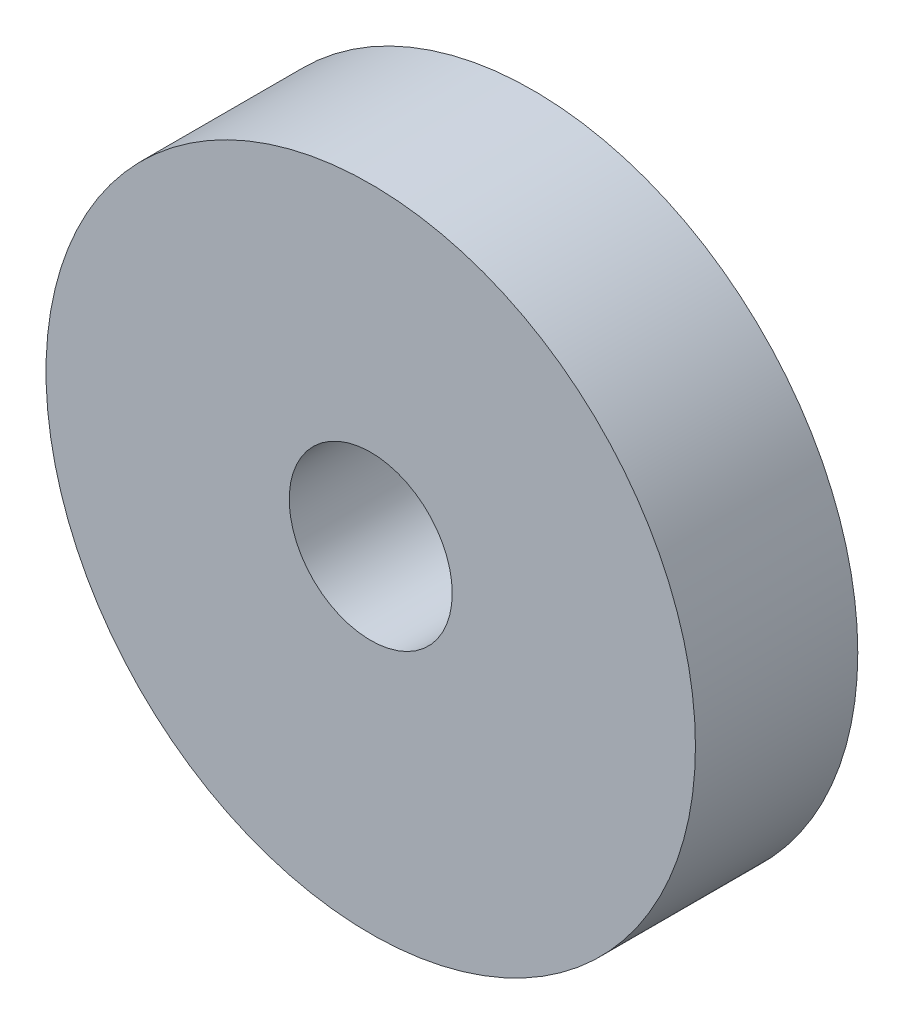
ISO-10303-21;
HEADER;
FILE_DESCRIPTION(('STEP AP214'),'2;1');
FILE_NAME('part.step','',(''),(''),'','','');
FILE_SCHEMA(('AUTOMOTIVE_DESIGN { 1 0 10303 214 1 1 1 1 }'));
ENDSEC;
DATA;
#1=APPLICATION_CONTEXT('core data for automotive mechanical design processes');
#2=APPLICATION_PROTOCOL_DEFINITION('international standard','automotive_design',2000,#1);
#3=PRODUCT_CONTEXT('',#1,'mechanical');
#4=PRODUCT('Part','Part','',(#3));
#5=PRODUCT_RELATED_PRODUCT_CATEGORY('part','',(#4));
#6=PRODUCT_DEFINITION_FORMATION('','',#4);
#7=PRODUCT_DEFINITION_CONTEXT('part definition',#1,'design');
#8=PRODUCT_DEFINITION('design','',#6,#7);
#9=PRODUCT_DEFINITION_SHAPE('','',#8);
#10=(LENGTH_UNIT() NAMED_UNIT(*) SI_UNIT(.MILLI.,.METRE.));
#11=(NAMED_UNIT(*) PLANE_ANGLE_UNIT() SI_UNIT($,.RADIAN.));
#12=(NAMED_UNIT(*) SI_UNIT($,.STERADIAN.) SOLID_ANGLE_UNIT());
#13=UNCERTAINTY_MEASURE_WITH_UNIT(LENGTH_MEASURE(1.E-05),#10,'distance_accuracy_value','');
#14=(GEOMETRIC_REPRESENTATION_CONTEXT(3) GLOBAL_UNCERTAINTY_ASSIGNED_CONTEXT((#13)) GLOBAL_UNIT_ASSIGNED_CONTEXT((#10,
#11,#12)) REPRESENTATION_CONTEXT('',''));
#15=CARTESIAN_POINT('',(0.,0.,0.));
#16=DIRECTION('',(0.,0.,1.));
#17=DIRECTION('',(1.,0.,0.));
#18=AXIS2_PLACEMENT_3D('',#15,#16,#17);
#19=CARTESIAN_POINT('',(0.,0.,5.));
#20=DIRECTION('',(0.,0.,1.));
#21=DIRECTION('',(1.,0.,0.));
#22=AXIS2_PLACEMENT_3D('',#19,#20,#21);
#23=PLANE('',#22);
#24=CARTESIAN_POINT('',(0.,0.,5.));
#25=DIRECTION('',(0.,0.,1.));
#26=DIRECTION('',(1.,0.,0.));
#27=AXIS2_PLACEMENT_3D('',#24,#25,#26);
#28=CIRCLE('',#27,10.);
#29=CARTESIAN_POINT('',(10.,0.,5.));
#30=VERTEX_POINT('',#29);
#31=EDGE_CURVE('E10',#30,#30,#28,.T.);
#32=ORIENTED_EDGE('',*,*,#31,.T.);
#33=EDGE_LOOP('',(#32));
#34=FACE_BOUND('',#33,.T.);
#35=CARTESIAN_POINT('',(0.,0.336336396998157,5.));
#36=DIRECTION('',(0.,0.,1.));
#37=DIRECTION('',(1.,0.,0.));
#38=AXIS2_PLACEMENT_3D('',#35,#36,#37);
#39=CIRCLE('',#38,2.51);
#40=CARTESIAN_POINT('',(2.51,0.336336396998157,5.));
#41=VERTEX_POINT('',#40);
#42=EDGE_CURVE('E42',#41,#41,#39,.T.);
#43=ORIENTED_EDGE('',*,*,#42,.F.);
#44=EDGE_LOOP('',(#43));
#45=FACE_BOUND('',#44,.T.);
#46=ADVANCED_FACE('F31',(#34,#45),#23,.T.);
#47=CARTESIAN_POINT('',(0.,0.,0.));
#48=DIRECTION('',(0.,0.,1.));
#49=DIRECTION('',(1.,0.,0.));
#50=AXIS2_PLACEMENT_3D('',#47,#48,#49);
#51=PLANE('',#50);
#52=CARTESIAN_POINT('',(0.,0.,0.));
#53=DIRECTION('',(0.,0.,1.));
#54=DIRECTION('',(1.,0.,0.));
#55=AXIS2_PLACEMENT_3D('',#52,#53,#54);
#56=CIRCLE('',#55,10.);
#57=CARTESIAN_POINT('',(10.,0.,0.));
#58=VERTEX_POINT('',#57);
#59=EDGE_CURVE('E35',#58,#58,#56,.T.);
#60=ORIENTED_EDGE('',*,*,#59,.F.);
#61=EDGE_LOOP('',(#60));
#62=FACE_BOUND('',#61,.T.);
#63=CARTESIAN_POINT('',(0.,0.336336396998157,0.));
#64=DIRECTION('',(0.,0.,1.));
#65=DIRECTION('',(1.,0.,0.));
#66=AXIS2_PLACEMENT_3D('',#63,#64,#65);
#67=CIRCLE('',#66,2.51);
#68=CARTESIAN_POINT('',(2.51,0.336336396998157,0.));
#69=VERTEX_POINT('',#68);
#70=EDGE_CURVE('E44',#69,#69,#67,.T.);
#71=ORIENTED_EDGE('',*,*,#70,.T.);
#72=EDGE_LOOP('',(#71));
#73=FACE_BOUND('',#72,.T.);
#74=ADVANCED_FACE('F54',(#62,#73),#51,.F.);
#75=CARTESIAN_POINT('',(0.,0.,5.));
#76=DIRECTION('',(0.,0.,-1.));
#77=DIRECTION('',(-1.,0.,0.));
#78=AXIS2_PLACEMENT_3D('',#75,#76,#77);
#79=CYLINDRICAL_SURFACE('',#78,10.);
#80=ORIENTED_EDGE('',*,*,#31,.F.);
#81=EDGE_LOOP('',(#80));
#82=FACE_BOUND('',#81,.T.);
#83=ORIENTED_EDGE('',*,*,#59,.T.);
#84=EDGE_LOOP('',(#83));
#85=FACE_BOUND('',#84,.T.);
#86=ADVANCED_FACE('F33',(#82,#85),#79,.T.);
#87=CARTESIAN_POINT('',(0.,0.336336396998157,5.));
#88=DIRECTION('',(0.,0.,-1.));
#89=DIRECTION('',(-1.,0.,0.));
#90=AXIS2_PLACEMENT_3D('',#87,#88,#89);
#91=CYLINDRICAL_SURFACE('',#90,2.51);
#92=ORIENTED_EDGE('',*,*,#42,.T.);
#93=EDGE_LOOP('',(#92));
#94=FACE_BOUND('',#93,.T.);
#95=ORIENTED_EDGE('',*,*,#70,.F.);
#96=EDGE_LOOP('',(#95));
#97=FACE_BOUND('',#96,.T.);
#98=ADVANCED_FACE('F50',(#94,#97),#91,.F.);
#99=CLOSED_SHELL('',(#46,#74,#86,#98));
#100=MANIFOLD_SOLID_BREP('B2',#99);
#101=ADVANCED_BREP_SHAPE_REPRESENTATION('',(#18,#100),#14);
#102=SHAPE_DEFINITION_REPRESENTATION(#9,#101);
ENDSEC;
END-ISO-10303-21;
